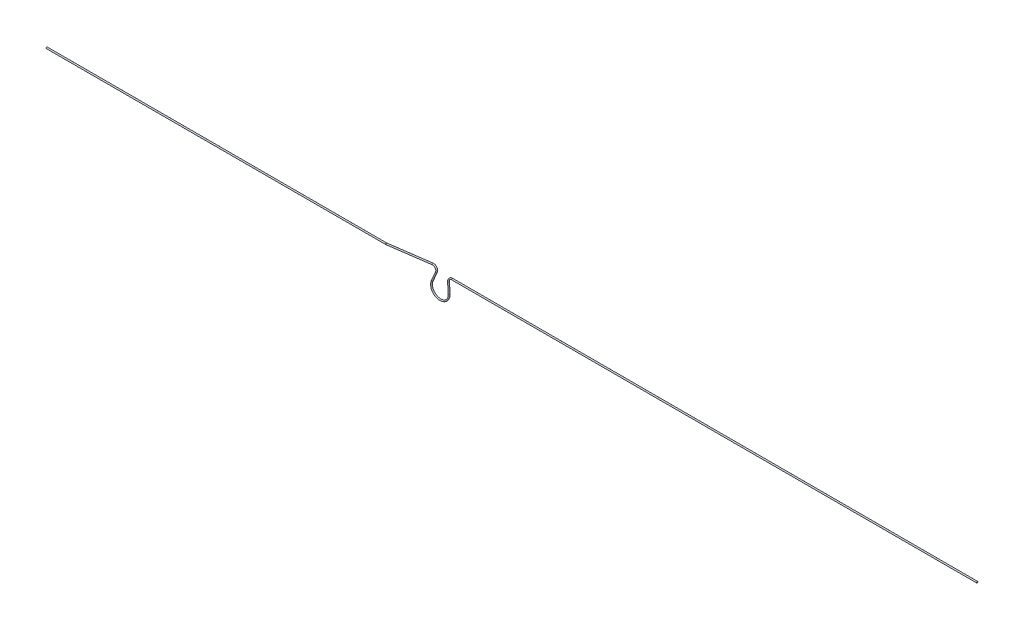
ISO-10303-21;
HEADER;
FILE_DESCRIPTION(('STEP AP214'),'2;1');
FILE_NAME('part.step','',(''),(''),'','','');
FILE_SCHEMA(('AUTOMOTIVE_DESIGN { 1 0 10303 214 1 1 1 1 }'));
ENDSEC;
DATA;
#1=APPLICATION_CONTEXT('core data for automotive mechanical design processes');
#2=APPLICATION_PROTOCOL_DEFINITION('international standard','automotive_design',2000,#1);
#3=PRODUCT_CONTEXT('',#1,'mechanical');
#4=PRODUCT('Part','Part','',(#3));
#5=PRODUCT_RELATED_PRODUCT_CATEGORY('part','',(#4));
#6=PRODUCT_DEFINITION_FORMATION('','',#4);
#7=PRODUCT_DEFINITION_CONTEXT('part definition',#1,'design');
#8=PRODUCT_DEFINITION('design','',#6,#7);
#9=PRODUCT_DEFINITION_SHAPE('','',#8);
#10=(LENGTH_UNIT() NAMED_UNIT(*) SI_UNIT(.MILLI.,.METRE.));
#11=(NAMED_UNIT(*) PLANE_ANGLE_UNIT() SI_UNIT($,.RADIAN.));
#12=(NAMED_UNIT(*) SI_UNIT($,.STERADIAN.) SOLID_ANGLE_UNIT());
#13=UNCERTAINTY_MEASURE_WITH_UNIT(LENGTH_MEASURE(1.E-05),#10,'distance_accuracy_value','');
#14=(GEOMETRIC_REPRESENTATION_CONTEXT(3) GLOBAL_UNCERTAINTY_ASSIGNED_CONTEXT((#13)) GLOBAL_UNIT_ASSIGNED_CONTEXT((#10,
#11,#12)) REPRESENTATION_CONTEXT('',''));
#15=CARTESIAN_POINT('',(0.,0.,0.));
#16=DIRECTION('',(0.,0.,1.));
#17=DIRECTION('',(1.,0.,0.));
#18=AXIS2_PLACEMENT_3D('',#15,#16,#17);
#19=CARTESIAN_POINT('',(0.,-5.5,0.));
#20=DIRECTION('',(-1.,0.,0.));
#21=DIRECTION('',(0.,-1.,0.));
#22=AXIS2_PLACEMENT_3D('',#19,#20,#21);
#23=CYLINDRICAL_SURFACE('',#22,1.);
#24=CARTESIAN_POINT('',(-500.,-5.5,0.));
#25=DIRECTION('',(1.,0.,0.));
#26=DIRECTION('',(0.,0.,-1.));
#27=AXIS2_PLACEMENT_3D('',#24,#25,#26);
#28=CIRCLE('',#27,1.);
#29=CARTESIAN_POINT('',(-500.,-5.5,-1.));
#30=VERTEX_POINT('',#29);
#31=EDGE_CURVE('E53',#30,#30,#28,.T.);
#32=ORIENTED_EDGE('',*,*,#31,.T.);
#33=EDGE_LOOP('',(#32));
#34=FACE_BOUND('',#33,.T.);
#35=CARTESIAN_POINT('',(0.,-5.5,0.));
#36=DIRECTION('',(1.,0.,0.));
#37=DIRECTION('',(0.,0.,-1.));
#38=AXIS2_PLACEMENT_3D('',#35,#36,#37);
#39=CIRCLE('',#38,1.);
#40=CARTESIAN_POINT('',(0.,-5.5,-1.));
#41=VERTEX_POINT('',#40);
#42=EDGE_CURVE('E12',#41,#41,#39,.T.);
#43=ORIENTED_EDGE('',*,*,#42,.F.);
#44=EDGE_LOOP('',(#43));
#45=FACE_BOUND('',#44,.T.);
#46=ADVANCED_FACE('F46',(#34,#45),#23,.T.);
#47=CARTESIAN_POINT('',(-500.,-5.5,0.));
#48=DIRECTION('',(1.,0.,0.));
#49=DIRECTION('',(0.,0.,-1.));
#50=AXIS2_PLACEMENT_3D('',#47,#48,#49);
#51=PLANE('',#50);
#52=ORIENTED_EDGE('',*,*,#31,.F.);
#53=EDGE_LOOP('',(#52));
#54=FACE_BOUND('',#53,.T.);
#55=ADVANCED_FACE('F61',(#54),#51,.F.);
#56=CARTESIAN_POINT('',(0.,-5.5,0.));
#57=DIRECTION('',(1.,0.,0.));
#58=DIRECTION('',(0.,0.,-1.));
#59=AXIS2_PLACEMENT_3D('',#56,#57,#58);
#60=PLANE('',#59);
#61=ORIENTED_EDGE('',*,*,#42,.T.);
#62=EDGE_LOOP('',(#61));
#63=FACE_BOUND('',#62,.T.);
#64=ADVANCED_FACE('F48',(#63),#60,.T.);
#65=CLOSED_SHELL('',(#46,#55,#64));
#66=MANIFOLD_SOLID_BREP('B2',#65);
#67=CARTESIAN_POINT('',(0.,0.,0.));
#68=DIRECTION('',(0.,0.,-1.));
#69=DIRECTION('',(-1.,0.,0.));
#70=AXIS2_PLACEMENT_3D('',#67,#68,#69);
#71=TOROIDAL_SURFACE('',#70,5.5,1.);
#72=CARTESIAN_POINT('',(0.682210197773186,-5.45752592719946,0.));
#73=DIRECTION('',(0.992277441308992,0.124038217776943,0.));
#74=DIRECTION('',(-0.124038217776943,0.992277441308992,0.));
#75=AXIS2_PLACEMENT_3D('',#72,#73,#74);
#76=CIRCLE('',#75,1.);
#77=CARTESIAN_POINT('',(0.806248415550129,-6.44980336850845,0.));
#78=VERTEX_POINT('',#77);
#79=EDGE_CURVE('E117',#78,#78,#76,.T.);
#80=CARTESIAN_POINT('',(0.,-5.5,0.));
#81=DIRECTION('',(-1.,0.,0.));
#82=DIRECTION('',(0.,0.,1.));
#83=AXIS2_PLACEMENT_3D('',#80,#81,#82);
#84=CIRCLE('',#83,1.);
#85=CARTESIAN_POINT('',(0.,-6.5,0.));
#86=VERTEX_POINT('',#85);
#87=EDGE_CURVE('E45',#86,#86,#84,.T.);
#88=CARTESIAN_POINT('',(0.,0.,0.));
#89=DIRECTION('',(0.,0.,-1.));
#90=DIRECTION('',(-1.,0.,0.));
#91=AXIS2_PLACEMENT_3D('',#88,#89,#90);
#92=CIRCLE('',#91,6.5);
#93=EDGE_CURVE('',#78,#86,#92,.T.);
#94=ORIENTED_EDGE('',*,*,#79,.F.);
#95=ORIENTED_EDGE('',*,*,#87,.F.);
#96=ORIENTED_EDGE('',*,*,#93,.T.);
#97=ORIENTED_EDGE('',*,*,#93,.F.);
#98=EDGE_LOOP('',(#94,#96,#95,#97));
#99=FACE_BOUND('',#98,.T.);
#100=ADVANCED_FACE('F113',(#99),#71,.T.);
#101=CARTESIAN_POINT('',(0.682210197773183,-5.45752592719945,0.));
#102=DIRECTION('',(0.992277441308992,0.124038217776943,0.));
#103=DIRECTION('',(-0.124038217776943,0.992277441308992,0.));
#104=AXIS2_PLACEMENT_3D('',#101,#102,#103);
#105=PLANE('',#104);
#106=ORIENTED_EDGE('',*,*,#79,.T.);
#107=EDGE_LOOP('',(#106));
#108=FACE_BOUND('',#107,.T.);
#109=ADVANCED_FACE('F126',(#108),#105,.T.);
#110=CARTESIAN_POINT('',(0.,-5.5,0.));
#111=DIRECTION('',(-1.,0.,0.));
#112=DIRECTION('',(0.,0.,1.));
#113=AXIS2_PLACEMENT_3D('',#110,#111,#112);
#114=PLANE('',#113);
#115=ORIENTED_EDGE('',*,*,#87,.T.);
#116=EDGE_LOOP('',(#115));
#117=FACE_BOUND('',#116,.T.);
#118=ADVANCED_FACE('F115',(#117),#114,.T.);
#119=CLOSED_SHELL('',(#100,#109,#118));
#120=MANIFOLD_SOLID_BREP('B7',#119);
#121=CARTESIAN_POINT('',(68.0007050312069,2.95752592719947,0.));
#122=DIRECTION('',(-0.992277441308992,-0.124038217776943,0.));
#123=DIRECTION('',(0.124038217776943,-0.992277441308992,0.));
#124=AXIS2_PLACEMENT_3D('',#121,#122,#123);
#125=CYLINDRICAL_SURFACE('',#124,1.);
#126=CARTESIAN_POINT('',(68.0007050312068,2.95752592719946,0.));
#127=DIRECTION('',(0.992277441308992,0.124038217776943,0.));
#128=DIRECTION('',(-0.124038217776943,0.992277441308992,0.));
#129=AXIS2_PLACEMENT_3D('',#126,#127,#128);
#130=CIRCLE('',#129,1.);
#131=CARTESIAN_POINT('',(67.8766668134299,3.94980336850845,0.));
#132=VERTEX_POINT('',#131);
#133=EDGE_CURVE('E189',#132,#132,#130,.T.);
#134=ORIENTED_EDGE('',*,*,#133,.F.);
#135=EDGE_LOOP('',(#134));
#136=FACE_BOUND('',#135,.T.);
#137=CARTESIAN_POINT('',(0.682210197773189,-5.45752592719946,0.));
#138=DIRECTION('',(-0.992277441308992,-0.124038217776943,0.));
#139=DIRECTION('',(0.124038217776943,-0.992277441308992,0.));
#140=AXIS2_PLACEMENT_3D('',#137,#138,#139);
#141=CIRCLE('',#140,1.);
#142=CARTESIAN_POINT('',(0.806248415550132,-6.44980336850846,0.));
#143=VERTEX_POINT('',#142);
#144=EDGE_CURVE('E112',#143,#143,#141,.T.);
#145=ORIENTED_EDGE('',*,*,#144,.F.);
#146=EDGE_LOOP('',(#145));
#147=FACE_BOUND('',#146,.T.);
#148=ADVANCED_FACE('F182',(#136,#147),#125,.T.);
#149=CARTESIAN_POINT('',(68.0007050312068,2.95752592719947,0.));
#150=DIRECTION('',(0.992277441308992,0.124038217776943,0.));
#151=DIRECTION('',(-0.124038217776943,0.992277441308992,0.));
#152=AXIS2_PLACEMENT_3D('',#149,#150,#151);
#153=PLANE('',#152);
#154=ORIENTED_EDGE('',*,*,#133,.T.);
#155=EDGE_LOOP('',(#154));
#156=FACE_BOUND('',#155,.T.);
#157=ADVANCED_FACE('F195',(#156),#153,.T.);
#158=CARTESIAN_POINT('',(0.682210197773183,-5.45752592719945,0.));
#159=DIRECTION('',(-0.992277441308992,-0.124038217776943,0.));
#160=DIRECTION('',(0.124038217776943,-0.992277441308992,0.));
#161=AXIS2_PLACEMENT_3D('',#158,#159,#160);
#162=PLANE('',#161);
#163=ORIENTED_EDGE('',*,*,#144,.T.);
#164=EDGE_LOOP('',(#163));
#165=FACE_BOUND('',#164,.T.);
#166=ADVANCED_FACE('F184',(#165),#162,.T.);
#167=CLOSED_SHELL('',(#148,#157,#166));
#168=MANIFOLD_SOLID_BREP('B40',#167);
#169=CARTESIAN_POINT('',(68.6829152289801,-2.49999999999999,0.));
#170=DIRECTION('',(0.,0.,1.));
#171=DIRECTION('',(1.,0.,0.));
#172=AXIS2_PLACEMENT_3D('',#169,#170,#171);
#173=TOROIDAL_SURFACE('',#172,5.50000000000002,1.);
#174=CARTESIAN_POINT('',(73.7213943063339,-4.70538626708957,0.));
#175=DIRECTION('',(-0.400979321289014,-0.916087104973431,0.));
#176=DIRECTION('',(0.916087104973431,-0.400979321289014,0.));
#177=AXIS2_PLACEMENT_3D('',#174,#175,#176);
#178=CIRCLE('',#177,1.);
#179=CARTESIAN_POINT('',(74.6374814113074,-5.10636558837859,0.));
#180=VERTEX_POINT('',#179);
#181=EDGE_CURVE('E255',#180,#180,#178,.T.);
#182=CARTESIAN_POINT('',(68.0007050312069,2.95752592719949,0.));
#183=DIRECTION('',(-0.992277441308992,-0.124038217776943,0.));
#184=DIRECTION('',(0.124038217776943,-0.992277441308992,0.));
#185=AXIS2_PLACEMENT_3D('',#182,#183,#184);
#186=CIRCLE('',#185,1.);
#187=CARTESIAN_POINT('',(67.8766668134299,3.94980336850848,0.));
#188=VERTEX_POINT('',#187);
#189=EDGE_CURVE('E181',#188,#188,#186,.T.);
#190=CARTESIAN_POINT('',(68.6829152289801,-2.49999999999999,0.));
#191=DIRECTION('',(0.,0.,1.));
#192=DIRECTION('',(1.,0.,0.));
#193=AXIS2_PLACEMENT_3D('',#190,#191,#192);
#194=CIRCLE('',#193,6.50000000000002);
#195=EDGE_CURVE('',#180,#188,#194,.T.);
#196=ORIENTED_EDGE('',*,*,#181,.F.);
#197=ORIENTED_EDGE('',*,*,#189,.F.);
#198=ORIENTED_EDGE('',*,*,#195,.T.);
#199=ORIENTED_EDGE('',*,*,#195,.F.);
#200=EDGE_LOOP('',(#196,#198,#197,#199));
#201=FACE_BOUND('',#200,.T.);
#202=ADVANCED_FACE('F251',(#201),#173,.T.);
#203=CARTESIAN_POINT('',(73.7213943063339,-4.70538626708956,0.));
#204=DIRECTION('',(-0.400979321289014,-0.916087104973431,0.));
#205=DIRECTION('',(0.916087104973431,-0.400979321289014,0.));
#206=AXIS2_PLACEMENT_3D('',#203,#204,#205);
#207=PLANE('',#206);
#208=ORIENTED_EDGE('',*,*,#181,.T.);
#209=EDGE_LOOP('',(#208));
#210=FACE_BOUND('',#209,.T.);
#211=ADVANCED_FACE('F264',(#210),#207,.T.);
#212=CARTESIAN_POINT('',(68.0007050312068,2.95752592719947,0.));
#213=DIRECTION('',(-0.992277441308992,-0.124038217776943,0.));
#214=DIRECTION('',(0.124038217776943,-0.992277441308992,0.));
#215=AXIS2_PLACEMENT_3D('',#212,#213,#214);
#216=PLANE('',#215);
#217=ORIENTED_EDGE('',*,*,#189,.T.);
#218=EDGE_LOOP('',(#217));
#219=FACE_BOUND('',#218,.T.);
#220=ADVANCED_FACE('F253',(#219),#216,.T.);
#221=CLOSED_SHELL('',(#202,#211,#220));
#222=MANIFOLD_SOLID_BREP('B107',#221);
#223=CARTESIAN_POINT('',(67.5908676353453,-18.7113365288998,0.));
#224=DIRECTION('',(0.400979321289013,0.916087104973431,0.));
#225=DIRECTION('',(-0.916087104973431,0.400979321289013,0.));
#226=AXIS2_PLACEMENT_3D('',#223,#224,#225);
#227=CYLINDRICAL_SURFACE('',#226,1.);
#228=CARTESIAN_POINT('',(67.5908676353454,-18.7113365288997,0.));
#229=DIRECTION('',(-0.400979321289014,-0.916087104973431,0.));
#230=DIRECTION('',(0.916087104973431,-0.400979321289014,0.));
#231=AXIS2_PLACEMENT_3D('',#228,#229,#230);
#232=CIRCLE('',#231,1.);
#233=CARTESIAN_POINT('',(66.674780530372,-18.3103572076107,0.));
#234=VERTEX_POINT('',#233);
#235=EDGE_CURVE('E327',#234,#234,#232,.T.);
#236=CARTESIAN_POINT('',(73.7213943063339,-4.70538626708957,0.));
#237=DIRECTION('',(0.400979321289014,0.916087104973431,0.));
#238=DIRECTION('',(-0.916087104973431,0.400979321289014,0.));
#239=AXIS2_PLACEMENT_3D('',#236,#237,#238);
#240=CIRCLE('',#239,1.);
#241=CARTESIAN_POINT('',(72.8053072013605,-4.30440694580055,0.));
#242=VERTEX_POINT('',#241);
#243=EDGE_CURVE('E250',#242,#242,#240,.T.);
#244=CARTESIAN_POINT('',(66.674780530372,-18.3103572076107,0.));
#245=CARTESIAN_POINT('',(66.7386401831948,-18.1644618923835,0.));
#246=CARTESIAN_POINT('',(66.8024998360176,-18.0185665771563,0.));
#247=CARTESIAN_POINT('',(66.9302191416632,-17.7267759467019,0.));
#248=CARTESIAN_POINT('',(66.994078794486,-17.5808806314747,0.));
#249=CARTESIAN_POINT('',(67.1217981001316,-17.2890900010203,0.));
#250=CARTESIAN_POINT('',(67.1856577529544,-17.1431946857931,0.));
#251=CARTESIAN_POINT('',(67.3133770586,-16.8514040553388,0.));
#252=CARTESIAN_POINT('',(67.3772367114228,-16.7055087401116,0.));
#253=CARTESIAN_POINT('',(67.5049560170683,-16.4137181096572,0.));
#254=CARTESIAN_POINT('',(67.5688156698912,-16.26782279443,0.));
#255=CARTESIAN_POINT('',(67.6965349755367,-15.9760321639756,0.));
#256=CARTESIAN_POINT('',(67.7603946283595,-15.8301368487484,0.));
#257=CARTESIAN_POINT('',(67.8881139340051,-15.5383462182941,0.));
#258=CARTESIAN_POINT('',(67.9519735868279,-15.3924509030669,0.));
#259=CARTESIAN_POINT('',(68.0796928924735,-15.1006602726125,0.));
#260=CARTESIAN_POINT('',(68.1435525452963,-14.9547649573853,0.));
#261=CARTESIAN_POINT('',(68.2712718509419,-14.6629743269309,0.));
#262=CARTESIAN_POINT('',(68.3351315037647,-14.5170790117037,0.));
#263=CARTESIAN_POINT('',(68.4628508094103,-14.2252883812494,0.));
#264=CARTESIAN_POINT('',(68.5267104622331,-14.0793930660222,0.));
#265=CARTESIAN_POINT('',(68.6544297678787,-13.7876024355678,0.));
#266=CARTESIAN_POINT('',(68.7182894207015,-13.6417071203406,0.));
#267=CARTESIAN_POINT('',(68.8460087263471,-13.3499164898862,0.));
#268=CARTESIAN_POINT('',(68.9098683791699,-13.2040211746591,0.));
#269=CARTESIAN_POINT('',(69.0375876848155,-12.9122305442047,0.));
#270=CARTESIAN_POINT('',(69.1014473376383,-12.7663352289775,0.));
#271=CARTESIAN_POINT('',(69.2291666432839,-12.4745445985231,0.));
#272=CARTESIAN_POINT('',(69.2930262961067,-12.3286492832959,0.));
#273=CARTESIAN_POINT('',(69.4207456017523,-12.0368586528415,0.));
#274=CARTESIAN_POINT('',(69.4846052545751,-11.8909633376144,0.));
#275=CARTESIAN_POINT('',(69.6123245602207,-11.59917270716,0.));
#276=CARTESIAN_POINT('',(69.6761842130434,-11.4532773919328,0.));
#277=CARTESIAN_POINT('',(69.803903518689,-11.1614867614784,0.));
#278=CARTESIAN_POINT('',(69.8677631715118,-11.0155914462512,0.));
#279=CARTESIAN_POINT('',(69.9954824771574,-10.7238008157968,0.));
#280=CARTESIAN_POINT('',(70.0593421299802,-10.5779055005697,0.));
#281=CARTESIAN_POINT('',(70.1870614356258,-10.2861148701153,0.));
#282=CARTESIAN_POINT('',(70.2509210884486,-10.1402195548881,0.));
#283=CARTESIAN_POINT('',(70.3786403940942,-9.84842892443372,0.));
#284=CARTESIAN_POINT('',(70.442500046917,-9.70253360920653,0.));
#285=CARTESIAN_POINT('',(70.5702193525626,-9.41074297875215,0.));
#286=CARTESIAN_POINT('',(70.6340790053854,-9.26484766352496,0.));
#287=CARTESIAN_POINT('',(70.761798311031,-8.97305703307059,0.));
#288=CARTESIAN_POINT('',(70.8256579638538,-8.8271617178434,0.));
#289=CARTESIAN_POINT('',(70.9533772694994,-8.53537108738902,0.));
#290=CARTESIAN_POINT('',(71.0172369223222,-8.38947577216183,0.));
#291=CARTESIAN_POINT('',(71.1449562279678,-8.09768514170745,0.));
#292=CARTESIAN_POINT('',(71.2088158807906,-7.95178982648027,0.));
#293=CARTESIAN_POINT('',(71.3365351864362,-7.65999919602589,0.));
#294=CARTESIAN_POINT('',(71.400394839259,-7.5141038807987,0.));
#295=CARTESIAN_POINT('',(71.5281141449046,-7.22231325034432,0.));
#296=CARTESIAN_POINT('',(71.5919737977274,-7.07641793511714,0.));
#297=CARTESIAN_POINT('',(71.7196931033729,-6.78462730466276,0.));
#298=CARTESIAN_POINT('',(71.7835527561958,-6.63873198943557,0.));
#299=CARTESIAN_POINT('',(71.9112720618413,-6.34694135898119,0.));
#300=CARTESIAN_POINT('',(71.9751317146641,-6.201046043754,0.));
#301=CARTESIAN_POINT('',(72.1028510203097,-5.90925541329963,0.));
#302=CARTESIAN_POINT('',(72.1667106731325,-5.76336009807244,0.));
#303=CARTESIAN_POINT('',(72.2944299787781,-5.47156946761806,0.));
#304=CARTESIAN_POINT('',(72.3582896316009,-5.32567415239087,0.));
#305=CARTESIAN_POINT('',(72.4860089372465,-5.0338835219365,0.));
#306=CARTESIAN_POINT('',(72.5498685900693,-4.88798820670931,0.));
#307=CARTESIAN_POINT('',(72.6775878957149,-4.59619757625493,0.));
#308=CARTESIAN_POINT('',(72.7414475485377,-4.45030226102774,0.));
#309=CARTESIAN_POINT('',(72.8053072013605,-4.30440694580055,0.));
#310=B_SPLINE_CURVE_WITH_KNOTS('',3,(#244,#245,#246,#247,#248,#249,#250,#251,#252,#253,#254,
#255,#256,#257,#258,#259,#260,#261,#262,#263,#264,#265,#266,#267,#268,#269,#270,#271,#272,#273,
#274,#275,#276,#277,#278,#279,#280,#281,#282,#283,#284,#285,#286,#287,#288,#289,#290,#291,#292,
#293,#294,#295,#296,#297,#298,#299,#300,#301,#302,#303,#304,#305,#306,#307,#308,#309),
.UNSPECIFIED.,.F.,.F.,(4,2,2,2,2,2,2,2,2,2,2,2,2,2,2,2,2,2,2,2,2,2,2,2,2,2,2,2,2,2,2,2,4),(0.,
0.477777651606895,0.955555303213793,1.43333295482069,1.91111060642758,2.38888825803448,
2.86666590964137,3.34444356124827,3.82222121285516,4.29999886446206,4.77777651606896,
5.25555416767585,5.73333181928275,6.21110947088964,6.68888712249654,7.16666477410343,
7.64444242571033,8.12222007731723,8.59999772892412,9.07777538053102,9.55555303213791,
10.0333306837448,10.5111083353517,10.9888859869586,11.4666636385655,11.9444412901724,
12.4222189417793,12.8999965933862,13.3777742449931,13.8555518966,14.3333295482069,
14.8111071998138,15.2888848514207),.UNSPECIFIED.);
#311=EDGE_CURVE('BSEAM320',#234,#242,#310,.T.);
#312=ORIENTED_EDGE('',*,*,#235,.F.);
#313=ORIENTED_EDGE('',*,*,#243,.F.);
#314=ORIENTED_EDGE('',*,*,#311,.T.);
#315=ORIENTED_EDGE('',*,*,#311,.F.);
#316=EDGE_LOOP('',(#312,#314,#313,#315));
#317=FACE_BOUND('',#316,.T.);
#318=ADVANCED_FACE('F320',(#317),#227,.T.);
#319=CARTESIAN_POINT('',(67.5908676353454,-18.7113365288996,0.));
#320=DIRECTION('',(-0.400979321289014,-0.916087104973431,0.));
#321=DIRECTION('',(0.916087104973431,-0.400979321289014,0.));
#322=AXIS2_PLACEMENT_3D('',#319,#320,#321);
#323=PLANE('',#322);
#324=ORIENTED_EDGE('',*,*,#235,.T.);
#325=EDGE_LOOP('',(#324));
#326=FACE_BOUND('',#325,.T.);
#327=ADVANCED_FACE('F333',(#326),#323,.T.);
#328=CARTESIAN_POINT('',(73.7213943063339,-4.70538626708956,0.));
#329=DIRECTION('',(0.400979321289014,0.916087104973431,0.));
#330=DIRECTION('',(-0.916087104973431,0.400979321289014,0.));
#331=AXIS2_PLACEMENT_3D('',#328,#329,#330);
#332=PLANE('',#331);
#333=ORIENTED_EDGE('',*,*,#243,.T.);
#334=EDGE_LOOP('',(#333));
#335=FACE_BOUND('',#334,.T.);
#336=ADVANCED_FACE('F322',(#335),#332,.T.);
#337=CLOSED_SHELL('',(#318,#327,#336));
#338=MANIFOLD_SOLID_BREP('B176',#337);
#339=CARTESIAN_POINT('',(79.5,-23.9240677056568,0.));
#340=DIRECTION('',(0.,0.,-1.));
#341=DIRECTION('',(-1.,0.,0.));
#342=AXIS2_PLACEMENT_3D('',#339,#340,#341);
#343=TOROIDAL_SURFACE('',#342,12.9999999999999,1.);
#344=CARTESIAN_POINT('',(92.4741733320631,-23.1050278106701,0.));
#345=DIRECTION('',(-0.0630030688451335,0.998013333235631,0.));
#346=DIRECTION('',(-0.998013333235631,-0.0630030688451335,0.));
#347=AXIS2_PLACEMENT_3D('',#344,#345,#346);
#348=CIRCLE('',#347,1.);
#349=CARTESIAN_POINT('',(93.4721866652988,-23.042024741825,0.));
#350=VERTEX_POINT('',#349);
#351=EDGE_CURVE('E393',#350,#350,#348,.T.);
#352=CARTESIAN_POINT('',(67.5908676353455,-18.7113365288997,0.));
#353=DIRECTION('',(0.400979321289014,0.916087104973431,0.));
#354=DIRECTION('',(-0.916087104973431,0.400979321289014,0.));
#355=AXIS2_PLACEMENT_3D('',#352,#353,#354);
#356=CIRCLE('',#355,1.);
#357=CARTESIAN_POINT('',(66.674780530372,-18.3103572076107,0.));
#358=VERTEX_POINT('',#357);
#359=EDGE_CURVE('E319',#358,#358,#356,.T.);
#360=CARTESIAN_POINT('',(79.5,-23.9240677056568,0.));
#361=DIRECTION('',(0.,0.,-1.));
#362=DIRECTION('',(-1.,0.,0.));
#363=AXIS2_PLACEMENT_3D('',#360,#361,#362);
#364=CIRCLE('',#363,13.9999999999999);
#365=EDGE_CURVE('',#350,#358,#364,.T.);
#366=ORIENTED_EDGE('',*,*,#351,.F.);
#367=ORIENTED_EDGE('',*,*,#359,.F.);
#368=ORIENTED_EDGE('',*,*,#365,.T.);
#369=ORIENTED_EDGE('',*,*,#365,.F.);
#370=EDGE_LOOP('',(#366,#368,#367,#369));
#371=FACE_BOUND('',#370,.T.);
#372=ADVANCED_FACE('F389',(#371),#343,.T.);
#373=CARTESIAN_POINT('',(92.4741733320632,-23.1050278106703,0.));
#374=DIRECTION('',(-0.0630030688451335,0.998013333235631,0.));
#375=DIRECTION('',(-0.998013333235631,-0.0630030688451335,0.));
#376=AXIS2_PLACEMENT_3D('',#373,#374,#375);
#377=PLANE('',#376);
#378=ORIENTED_EDGE('',*,*,#351,.T.);
#379=EDGE_LOOP('',(#378));
#380=FACE_BOUND('',#379,.T.);
#381=ADVANCED_FACE('F402',(#380),#377,.T.);
#382=CARTESIAN_POINT('',(67.5908676353454,-18.7113365288996,0.));
#383=DIRECTION('',(0.400979321289014,0.916087104973431,0.));
#384=DIRECTION('',(-0.916087104973431,0.400979321289014,0.));
#385=AXIS2_PLACEMENT_3D('',#382,#383,#384);
#386=PLANE('',#385);
#387=ORIENTED_EDGE('',*,*,#359,.T.);
#388=EDGE_LOOP('',(#387));
#389=FACE_BOUND('',#388,.T.);
#390=ADVANCED_FACE('F391',(#389),#386,.T.);
#391=CLOSED_SHELL('',(#372,#381,#390));
#392=MANIFOLD_SOLID_BREP('B245',#391);
#393=CARTESIAN_POINT('',(91.5109266672039,-7.84651687864792,0.));
#394=DIRECTION('',(0.06300306884512,-0.998013333235632,0.));
#395=DIRECTION('',(0.998013333235632,0.06300306884512,0.));
#396=AXIS2_PLACEMENT_3D('',#393,#394,#395);
#397=CYLINDRICAL_SURFACE('',#396,1.);
#398=CARTESIAN_POINT('',(91.510926667204,-7.84651687864816,0.));
#399=DIRECTION('',(-0.0630030688451196,0.998013333235632,0.));
#400=DIRECTION('',(-0.998013333235632,-0.0630030688451196,0.));
#401=AXIS2_PLACEMENT_3D('',#398,#399,#400);
#402=CIRCLE('',#401,1.);
#403=CARTESIAN_POINT('',(92.5089400004396,-7.78351380980304,0.));
#404=VERTEX_POINT('',#403);
#405=EDGE_CURVE('E465',#404,#404,#402,.T.);
#406=CARTESIAN_POINT('',(92.4741733320631,-23.1050278106703,0.));
#407=DIRECTION('',(0.0630030688451196,-0.998013333235632,0.));
#408=DIRECTION('',(0.998013333235632,0.0630030688451196,0.));
#409=AXIS2_PLACEMENT_3D('',#406,#407,#408);
#410=CIRCLE('',#409,1.);
#411=CARTESIAN_POINT('',(93.4721866652988,-23.0420247418251,0.));
#412=VERTEX_POINT('',#411);
#413=EDGE_CURVE('E388',#412,#412,#410,.T.);
#414=CARTESIAN_POINT('',(92.5089400004396,-7.78351380980304,0.));
#415=CARTESIAN_POINT('',(92.5189738198652,-7.94245663201161,0.));
#416=CARTESIAN_POINT('',(92.5290076392908,-8.10139945422017,0.));
#417=CARTESIAN_POINT('',(92.5490752781421,-8.4192850986373,0.));
#418=CARTESIAN_POINT('',(92.5591090975677,-8.57822792084586,0.));
#419=CARTESIAN_POINT('',(92.5791767364189,-8.89611356526299,0.));
#420=CARTESIAN_POINT('',(92.5892105558445,-9.05505638747155,0.));
#421=CARTESIAN_POINT('',(92.6092781946958,-9.37294203188868,0.));
#422=CARTESIAN_POINT('',(92.6193120141214,-9.53188485409724,0.));
#423=CARTESIAN_POINT('',(92.6393796529726,-9.84977049851437,0.));
#424=CARTESIAN_POINT('',(92.6494134723982,-10.0087133207229,0.));
#425=CARTESIAN_POINT('',(92.6694811112495,-10.3265989651401,0.));
#426=CARTESIAN_POINT('',(92.6795149306751,-10.4855417873486,0.));
#427=CARTESIAN_POINT('',(92.6995825695263,-10.8034274317658,0.));
#428=CARTESIAN_POINT('',(92.7096163889519,-10.9623702539743,0.));
#429=CARTESIAN_POINT('',(92.7296840278032,-11.2802558983914,0.));
#430=CARTESIAN_POINT('',(92.7397178472288,-11.4391987206,0.));
#431=CARTESIAN_POINT('',(92.75978548608,-11.7570843650171,0.));
#432=CARTESIAN_POINT('',(92.7698193055056,-11.9160271872257,0.));
#433=CARTESIAN_POINT('',(92.7898869443569,-12.2339128316428,0.));
#434=CARTESIAN_POINT('',(92.7999207637825,-12.3928556538514,0.));
#435=CARTESIAN_POINT('',(92.8199884026337,-12.7107412982685,0.));
#436=CARTESIAN_POINT('',(92.8300222220593,-12.8696841204771,0.));
#437=CARTESIAN_POINT('',(92.8500898609106,-13.1875697648942,0.));
#438=CARTESIAN_POINT('',(92.8601236803362,-13.3465125871028,0.));
#439=CARTESIAN_POINT('',(92.8801913191874,-13.6643982315199,0.));
#440=CARTESIAN_POINT('',(92.890225138613,-13.8233410537285,0.));
#441=CARTESIAN_POINT('',(92.9102927774643,-14.1412266981456,0.));
#442=CARTESIAN_POINT('',(92.9203265968899,-14.3001695203541,0.));
#443=CARTESIAN_POINT('',(92.9403942357411,-14.6180551647713,0.));
#444=CARTESIAN_POINT('',(92.9504280551667,-14.7769979869798,0.));
#445=CARTESIAN_POINT('',(92.970495694018,-15.094883631397,0.));
#446=CARTESIAN_POINT('',(92.9805295134436,-15.2538264536055,0.));
#447=CARTESIAN_POINT('',(93.0005971522948,-15.5717120980227,0.));
#448=CARTESIAN_POINT('',(93.0106309717204,-15.7306549202312,0.));
#449=CARTESIAN_POINT('',(93.0306986105717,-16.0485405646483,0.));
#450=CARTESIAN_POINT('',(93.0407324299973,-16.2074833868569,0.));
#451=CARTESIAN_POINT('',(93.0608000688485,-16.525369031274,0.));
#452=CARTESIAN_POINT('',(93.0708338882741,-16.6843118534826,0.));
#453=CARTESIAN_POINT('',(93.0909015271254,-17.0021974978997,0.));
#454=CARTESIAN_POINT('',(93.100935346551,-17.1611403201083,0.));
#455=CARTESIAN_POINT('',(93.1210029854022,-17.4790259645254,0.));
#456=CARTESIAN_POINT('',(93.1310368048278,-17.637968786734,0.));
#457=CARTESIAN_POINT('',(93.151104443679,-17.9558544311511,0.));
#458=CARTESIAN_POINT('',(93.1611382631047,-18.1147972533597,0.));
#459=CARTESIAN_POINT('',(93.1812059019559,-18.4326828977768,0.));
#460=CARTESIAN_POINT('',(93.1912397213815,-18.5916257199854,0.));
#461=CARTESIAN_POINT('',(93.2113073602328,-18.9095113644025,0.));
#462=CARTESIAN_POINT('',(93.2213411796584,-19.0684541866111,0.));
#463=CARTESIAN_POINT('',(93.2414088185096,-19.3863398310282,0.));
#464=CARTESIAN_POINT('',(93.2514426379352,-19.5452826532367,0.));
#465=CARTESIAN_POINT('',(93.2715102767864,-19.8631682976539,0.));
#466=CARTESIAN_POINT('',(93.2815440962121,-20.0221111198624,0.));
#467=CARTESIAN_POINT('',(93.3016117350633,-20.3399967642796,0.));
#468=CARTESIAN_POINT('',(93.3116455544889,-20.4989395864881,0.));
#469=CARTESIAN_POINT('',(93.3317131933401,-20.8168252309053,0.));
#470=CARTESIAN_POINT('',(93.3417470127658,-20.9757680531138,0.));
#471=CARTESIAN_POINT('',(93.361814651617,-21.2936536975309,0.));
#472=CARTESIAN_POINT('',(93.3718484710426,-21.4525965197395,0.));
#473=CARTESIAN_POINT('',(93.3919161098939,-21.7704821641566,0.));
#474=CARTESIAN_POINT('',(93.4019499293195,-21.9294249863652,0.));
#475=CARTESIAN_POINT('',(93.4220175681707,-22.2473106307823,0.));
#476=CARTESIAN_POINT('',(93.4320513875963,-22.4062534529909,0.));
#477=CARTESIAN_POINT('',(93.4521190264475,-22.724139097408,0.));
#478=CARTESIAN_POINT('',(93.4621528458731,-22.8830819196166,0.));
#479=CARTESIAN_POINT('',(93.4721866652988,-23.0420247418251,0.));
#480=B_SPLINE_CURVE_WITH_KNOTS('',3,(#414,#415,#416,#417,#418,#419,#420,#421,#422,#423,#424,
#425,#426,#427,#428,#429,#430,#431,#432,#433,#434,#435,#436,#437,#438,#439,#440,#441,#442,#443,
#444,#445,#446,#447,#448,#449,#450,#451,#452,#453,#454,#455,#456,#457,#458,#459,#460,#461,#462,
#463,#464,#465,#466,#467,#468,#469,#470,#471,#472,#473,#474,#475,#476,#477,#478,#479),
.UNSPECIFIED.,.F.,.F.,(4,2,2,2,2,2,2,2,2,2,2,2,2,2,2,2,2,2,2,2,2,2,2,2,2,2,2,2,2,2,2,2,4),(0.,
0.477777651606895,0.955555303213792,1.43333295482069,1.91111060642758,2.38888825803448,
2.86666590964137,3.34444356124827,3.82222121285517,4.29999886446206,4.77777651606896,
5.25555416767585,5.73333181928275,6.21110947088965,6.68888712249654,7.16666477410343,
7.64444242571033,8.12222007731723,8.59999772892412,9.07777538053102,9.55555303213791,
10.0333306837448,10.5111083353517,10.9888859869586,11.4666636385655,11.9444412901724,
12.4222189417793,12.8999965933862,13.3777742449931,13.8555518966,14.3333295482069,
14.8111071998138,15.2888848514207),.UNSPECIFIED.);
#481=EDGE_CURVE('BSEAM458',#404,#412,#480,.T.);
#482=ORIENTED_EDGE('',*,*,#405,.F.);
#483=ORIENTED_EDGE('',*,*,#413,.F.);
#484=ORIENTED_EDGE('',*,*,#481,.T.);
#485=ORIENTED_EDGE('',*,*,#481,.F.);
#486=EDGE_LOOP('',(#482,#484,#483,#485));
#487=FACE_BOUND('',#486,.T.);
#488=ADVANCED_FACE('F458',(#487),#397,.T.);
#489=CARTESIAN_POINT('',(91.510926667204,-7.84651687864816,0.));
#490=DIRECTION('',(-0.0630030688451196,0.998013333235632,0.));
#491=DIRECTION('',(-0.998013333235632,-0.0630030688451196,0.));
#492=AXIS2_PLACEMENT_3D('',#489,#490,#491);
#493=PLANE('',#492);
#494=ORIENTED_EDGE('',*,*,#405,.T.);
#495=EDGE_LOOP('',(#494));
#496=FACE_BOUND('',#495,.T.);
#497=ADVANCED_FACE('F471',(#496),#493,.T.);
#498=CARTESIAN_POINT('',(92.4741733320632,-23.1050278106703,0.));
#499=DIRECTION('',(0.0630030688451196,-0.998013333235632,0.));
#500=DIRECTION('',(0.998013333235632,0.0630030688451196,0.));
#501=AXIS2_PLACEMENT_3D('',#498,#499,#500);
#502=PLANE('',#501);
#503=ORIENTED_EDGE('',*,*,#413,.T.);
#504=EDGE_LOOP('',(#503));
#505=FACE_BOUND('',#504,.T.);
#506=ADVANCED_FACE('F460',(#505),#502,.T.);
#507=CLOSED_SHELL('',(#488,#497,#506));
#508=MANIFOLD_SOLID_BREP('B314',#507);
#509=CARTESIAN_POINT('',(97.,-7.49999999999999,0.));
#510=DIRECTION('',(0.,0.,1.));
#511=DIRECTION('',(1.,0.,0.));
#512=AXIS2_PLACEMENT_3D('',#509,#510,#511);
#513=TOROIDAL_SURFACE('',#512,5.50000000000007,1.);
#514=CARTESIAN_POINT('',(97.,-1.99999999999992,0.));
#515=DIRECTION('',(1.,0.,0.));
#516=DIRECTION('',(0.,1.,0.));
#517=AXIS2_PLACEMENT_3D('',#514,#515,#516);
#518=CIRCLE('',#517,1.);
#519=CARTESIAN_POINT('',(97.,-0.999999999999918,0.));
#520=VERTEX_POINT('',#519);
#521=EDGE_CURVE('E530',#520,#520,#518,.T.);
#522=CARTESIAN_POINT('',(91.510926667204,-7.84651687864816,0.));
#523=DIRECTION('',(0.0630030688451196,-0.998013333235632,0.));
#524=DIRECTION('',(0.998013333235632,0.0630030688451196,0.));
#525=AXIS2_PLACEMENT_3D('',#522,#523,#524);
#526=CIRCLE('',#525,1.);
#527=CARTESIAN_POINT('',(90.5129133339683,-7.90951994749328,0.));
#528=VERTEX_POINT('',#527);
#529=EDGE_CURVE('E457',#528,#528,#526,.T.);
#530=CARTESIAN_POINT('',(97.,-7.49999999999999,0.));
#531=DIRECTION('',(0.,0.,1.));
#532=DIRECTION('',(1.,0.,0.));
#533=AXIS2_PLACEMENT_3D('',#530,#531,#532);
#534=CIRCLE('',#533,6.50000000000008);
#535=EDGE_CURVE('',#520,#528,#534,.T.);
#536=ORIENTED_EDGE('',*,*,#521,.F.);
#537=ORIENTED_EDGE('',*,*,#529,.F.);
#538=ORIENTED_EDGE('',*,*,#535,.T.);
#539=ORIENTED_EDGE('',*,*,#535,.F.);
#540=EDGE_LOOP('',(#536,#538,#537,#539));
#541=FACE_BOUND('',#540,.T.);
#542=ADVANCED_FACE('F526',(#541),#513,.T.);
#543=CARTESIAN_POINT('',(97.,-2.,0.));
#544=DIRECTION('',(1.,0.,0.));
#545=DIRECTION('',(0.,1.,0.));
#546=AXIS2_PLACEMENT_3D('',#543,#544,#545);
#547=PLANE('',#546);
#548=ORIENTED_EDGE('',*,*,#521,.T.);
#549=EDGE_LOOP('',(#548));
#550=FACE_BOUND('',#549,.T.);
#551=ADVANCED_FACE('F539',(#550),#547,.T.);
#552=CARTESIAN_POINT('',(91.510926667204,-7.84651687864816,0.));
#553=DIRECTION('',(0.0630030688451196,-0.998013333235632,0.));
#554=DIRECTION('',(0.998013333235632,0.0630030688451196,0.));
#555=AXIS2_PLACEMENT_3D('',#552,#553,#554);
#556=PLANE('',#555);
#557=ORIENTED_EDGE('',*,*,#529,.T.);
#558=EDGE_LOOP('',(#557));
#559=FACE_BOUND('',#558,.T.);
#560=ADVANCED_FACE('F528',(#559),#556,.T.);
#561=CLOSED_SHELL('',(#542,#551,#560));
#562=MANIFOLD_SOLID_BREP('B383',#561);
#563=CARTESIAN_POINT('',(869.995529189786,-2.00000000000041,0.));
#564=DIRECTION('',(-1.,0.,0.));
#565=DIRECTION('',(0.,0.,1.));
#566=AXIS2_PLACEMENT_3D('',#563,#564,#565);
#567=CYLINDRICAL_SURFACE('',#566,1.);
#568=CARTESIAN_POINT('',(869.995529189786,-2.00000000000041,0.));
#569=DIRECTION('',(1.,0.,0.));
#570=DIRECTION('',(0.,0.,-1.));
#571=AXIS2_PLACEMENT_3D('',#568,#569,#570);
#572=CIRCLE('',#571,1.);
#573=CARTESIAN_POINT('',(869.995529189786,-2.00000000000041,1.));
#574=VERTEX_POINT('',#573);
#575=EDGE_CURVE('E594',#574,#574,#572,.T.);
#576=CARTESIAN_POINT('',(97.,-2.00000000000041,0.));
#577=DIRECTION('',(-1.,0.,0.));
#578=DIRECTION('',(0.,0.,1.));
#579=AXIS2_PLACEMENT_3D('',#576,#577,#578);
#580=CIRCLE('',#579,1.);
#581=CARTESIAN_POINT('',(97.0000000000001,-2.00000000000041,1.));
#582=VERTEX_POINT('',#581);
#583=EDGE_CURVE('E525',#582,#582,#580,.T.);
#584=CARTESIAN_POINT('',(869.995529189786,-2.00000000000041,1.));
#585=CARTESIAN_POINT('',(861.943492427392,-2.00000000000041,1.));
#586=CARTESIAN_POINT('',(853.891455664999,-2.00000000000041,1.));
#587=CARTESIAN_POINT('',(837.787382140211,-2.00000000000041,1.));
#588=CARTESIAN_POINT('',(829.735345377818,-2.00000000000041,1.));
#589=CARTESIAN_POINT('',(813.631271853031,-2.00000000000041,1.));
#590=CARTESIAN_POINT('',(805.579235090637,-2.00000000000041,1.));
#591=CARTESIAN_POINT('',(789.47516156585,-2.00000000000041,1.));
#592=CARTESIAN_POINT('',(781.423124803456,-2.00000000000041,1.));
#593=CARTESIAN_POINT('',(765.319051278669,-2.00000000000041,1.));
#594=CARTESIAN_POINT('',(757.267014516275,-2.00000000000041,1.));
#595=CARTESIAN_POINT('',(741.162940991488,-2.00000000000041,1.));
#596=CARTESIAN_POINT('',(733.110904229095,-2.00000000000041,1.));
#597=CARTESIAN_POINT('',(717.006830704307,-2.00000000000041,1.));
#598=CARTESIAN_POINT('',(708.954793941914,-2.00000000000041,1.));
#599=CARTESIAN_POINT('',(692.850720417127,-2.00000000000041,1.));
#600=CARTESIAN_POINT('',(684.798683654733,-2.00000000000041,1.));
#601=CARTESIAN_POINT('',(668.694610129946,-2.00000000000041,1.));
#602=CARTESIAN_POINT('',(660.642573367552,-2.00000000000041,1.));
#603=CARTESIAN_POINT('',(644.538499842765,-2.00000000000041,1.));
#604=CARTESIAN_POINT('',(636.486463080371,-2.00000000000041,1.));
#605=CARTESIAN_POINT('',(620.382389555584,-2.00000000000041,1.));
#606=CARTESIAN_POINT('',(612.330352793191,-2.00000000000041,1.));
#607=CARTESIAN_POINT('',(596.226279268403,-2.00000000000041,1.));
#608=CARTESIAN_POINT('',(588.17424250601,-2.00000000000041,1.));
#609=CARTESIAN_POINT('',(572.070168981223,-2.00000000000041,1.));
#610=CARTESIAN_POINT('',(564.018132218829,-2.00000000000041,1.));
#611=CARTESIAN_POINT('',(547.914058694042,-2.00000000000041,1.));
#612=CARTESIAN_POINT('',(539.862021931648,-2.00000000000041,1.));
#613=CARTESIAN_POINT('',(523.757948406861,-2.00000000000041,1.));
#614=CARTESIAN_POINT('',(515.705911644467,-2.00000000000041,1.));
#615=CARTESIAN_POINT('',(499.60183811968,-2.00000000000041,1.));
#616=CARTESIAN_POINT('',(491.549801357287,-2.00000000000041,1.));
#617=CARTESIAN_POINT('',(475.445727832499,-2.00000000000041,1.));
#618=CARTESIAN_POINT('',(467.393691070106,-2.00000000000041,1.));
#619=CARTESIAN_POINT('',(451.289617545319,-2.00000000000041,1.));
#620=CARTESIAN_POINT('',(443.237580782925,-2.00000000000041,1.));
#621=CARTESIAN_POINT('',(427.133507258138,-2.00000000000041,1.));
#622=CARTESIAN_POINT('',(419.081470495744,-2.00000000000041,1.));
#623=CARTESIAN_POINT('',(402.977396970957,-2.00000000000041,1.));
#624=CARTESIAN_POINT('',(394.925360208563,-2.00000000000041,1.));
#625=CARTESIAN_POINT('',(378.821286683776,-2.00000000000041,1.));
#626=CARTESIAN_POINT('',(370.769249921383,-2.00000000000041,1.));
#627=CARTESIAN_POINT('',(354.665176396595,-2.00000000000041,1.));
#628=CARTESIAN_POINT('',(346.613139634202,-2.00000000000041,1.));
#629=CARTESIAN_POINT('',(330.509066109415,-2.00000000000041,1.));
#630=CARTESIAN_POINT('',(322.457029347021,-2.00000000000041,1.));
#631=CARTESIAN_POINT('',(306.352955822234,-2.00000000000041,1.));
#632=CARTESIAN_POINT('',(298.30091905984,-2.00000000000041,1.));
#633=CARTESIAN_POINT('',(282.196845535053,-2.00000000000041,1.));
#634=CARTESIAN_POINT('',(274.144808772659,-2.00000000000041,1.));
#635=CARTESIAN_POINT('',(258.040735247872,-2.00000000000041,1.));
#636=CARTESIAN_POINT('',(249.988698485479,-2.00000000000041,1.));
#637=CARTESIAN_POINT('',(233.884624960691,-2.00000000000041,1.));
#638=CARTESIAN_POINT('',(225.832588198298,-2.00000000000041,1.));
#639=CARTESIAN_POINT('',(209.728514673511,-2.00000000000041,1.));
#640=CARTESIAN_POINT('',(201.676477911117,-2.00000000000041,1.));
#641=CARTESIAN_POINT('',(185.57240438633,-2.00000000000041,1.));
#642=CARTESIAN_POINT('',(177.520367623936,-2.00000000000041,1.));
#643=CARTESIAN_POINT('',(161.416294099149,-2.00000000000041,1.));
#644=CARTESIAN_POINT('',(153.364257336755,-2.00000000000041,1.));
#645=CARTESIAN_POINT('',(137.260183811968,-2.00000000000041,1.));
#646=CARTESIAN_POINT('',(129.208147049574,-2.00000000000041,1.));
#647=CARTESIAN_POINT('',(113.104073524787,-2.00000000000041,1.));
#648=CARTESIAN_POINT('',(105.052036762394,-2.00000000000041,1.));
#649=CARTESIAN_POINT('',(97.0000000000001,-2.00000000000041,1.));
#650=B_SPLINE_CURVE_WITH_KNOTS('',3,(#584,#585,#586,#587,#588,#589,#590,#591,#592,#593,#594,
#595,#596,#597,#598,#599,#600,#601,#602,#603,#604,#605,#606,#607,#608,#609,#610,#611,#612,#613,
#614,#615,#616,#617,#618,#619,#620,#621,#622,#623,#624,#625,#626,#627,#628,#629,#630,#631,#632,
#633,#634,#635,#636,#637,#638,#639,#640,#641,#642,#643,#644,#645,#646,#647,#648,#649),
.UNSPECIFIED.,.F.,.F.,(4,2,2,2,2,2,2,2,2,2,2,2,2,2,2,2,2,2,2,2,2,2,2,2,2,2,2,2,2,2,2,2,4),(0.,
24.1561102871808,48.3122205743616,72.4683308615424,96.6244411487232,120.780551435904,
144.936661723085,169.092772010266,193.248882297446,217.404992584627,241.561102871808,
265.717213158989,289.87332344617,314.02943373335,338.185544020531,362.341654307712,
386.497764594893,410.653874882074,434.809985169254,458.966095456435,483.122205743616,
507.278316030797,531.434426317978,555.590536605158,579.746646892339,603.90275717952,
628.058867466701,652.214977753882,676.371088041062,700.527198328243,724.683308615424,
748.839418902605,772.995529189786),.UNSPECIFIED.);
#651=EDGE_CURVE('BSEAM587',#574,#582,#650,.T.);
#652=ORIENTED_EDGE('',*,*,#575,.F.);
#653=ORIENTED_EDGE('',*,*,#583,.F.);
#654=ORIENTED_EDGE('',*,*,#651,.T.);
#655=ORIENTED_EDGE('',*,*,#651,.F.);
#656=EDGE_LOOP('',(#652,#654,#653,#655));
#657=FACE_BOUND('',#656,.T.);
#658=ADVANCED_FACE('F587',(#657),#567,.T.);
#659=CARTESIAN_POINT('',(869.995529189786,-2.00000000000041,0.));
#660=DIRECTION('',(1.,0.,0.));
#661=DIRECTION('',(0.,0.,-1.));
#662=AXIS2_PLACEMENT_3D('',#659,#660,#661);
#663=PLANE('',#662);
#664=ORIENTED_EDGE('',*,*,#575,.T.);
#665=EDGE_LOOP('',(#664));
#666=FACE_BOUND('',#665,.T.);
#667=ADVANCED_FACE('F600',(#666),#663,.T.);
#668=CARTESIAN_POINT('',(97.,-2.,0.));
#669=DIRECTION('',(-1.,0.,0.));
#670=DIRECTION('',(0.,0.,1.));
#671=AXIS2_PLACEMENT_3D('',#668,#669,#670);
#672=PLANE('',#671);
#673=ORIENTED_EDGE('',*,*,#583,.T.);
#674=EDGE_LOOP('',(#673));
#675=FACE_BOUND('',#674,.T.);
#676=ADVANCED_FACE('F589',(#675),#672,.T.);
#677=CLOSED_SHELL('',(#658,#667,#676));
#678=MANIFOLD_SOLID_BREP('B452',#677);
#679=ADVANCED_BREP_SHAPE_REPRESENTATION('',(#18,#66,#120,#168,#222,#338,#392,#508,#562,#678),#14);
#680=SHAPE_DEFINITION_REPRESENTATION(#9,#679);
ENDSEC;
END-ISO-10303-21;
